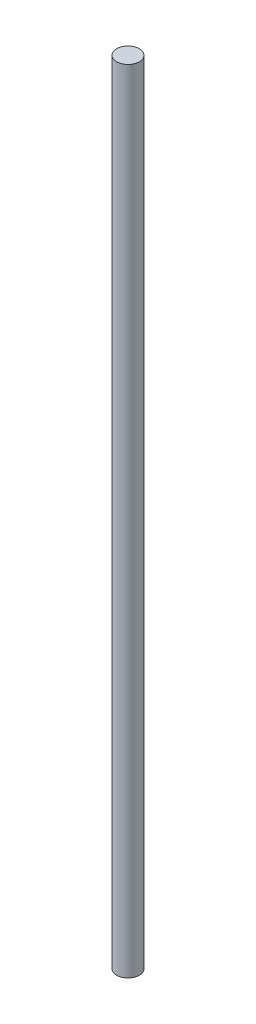
ISO-10303-21;
HEADER;
FILE_DESCRIPTION(('STEP AP214'),'2;1');
FILE_NAME('part.step','',(''),(''),'','','');
FILE_SCHEMA(('AUTOMOTIVE_DESIGN { 1 0 10303 214 1 1 1 1 }'));
ENDSEC;
DATA;
#1=APPLICATION_CONTEXT('core data for automotive mechanical design processes');
#2=APPLICATION_PROTOCOL_DEFINITION('international standard','automotive_design',2000,#1);
#3=PRODUCT_CONTEXT('',#1,'mechanical');
#4=PRODUCT('Part','Part','',(#3));
#5=PRODUCT_RELATED_PRODUCT_CATEGORY('part','',(#4));
#6=PRODUCT_DEFINITION_FORMATION('','',#4);
#7=PRODUCT_DEFINITION_CONTEXT('part definition',#1,'design');
#8=PRODUCT_DEFINITION('design','',#6,#7);
#9=PRODUCT_DEFINITION_SHAPE('','',#8);
#10=(LENGTH_UNIT() NAMED_UNIT(*) SI_UNIT(.MILLI.,.METRE.));
#11=(NAMED_UNIT(*) PLANE_ANGLE_UNIT() SI_UNIT($,.RADIAN.));
#12=(NAMED_UNIT(*) SI_UNIT($,.STERADIAN.) SOLID_ANGLE_UNIT());
#13=UNCERTAINTY_MEASURE_WITH_UNIT(LENGTH_MEASURE(1.E-05),#10,'distance_accuracy_value','');
#14=(GEOMETRIC_REPRESENTATION_CONTEXT(3) GLOBAL_UNCERTAINTY_ASSIGNED_CONTEXT((#13)) GLOBAL_UNIT_ASSIGNED_CONTEXT((#10,
#11,#12)) REPRESENTATION_CONTEXT('',''));
#15=CARTESIAN_POINT('',(0.,0.,0.));
#16=DIRECTION('',(0.,0.,1.));
#17=DIRECTION('',(1.,0.,0.));
#18=AXIS2_PLACEMENT_3D('',#15,#16,#17);
#19=CARTESIAN_POINT('',(0.,35.,0.));
#20=DIRECTION('',(0.,-1.,0.));
#21=DIRECTION('',(0.,0.,-1.));
#22=AXIS2_PLACEMENT_3D('',#19,#20,#21);
#23=CYLINDRICAL_SURFACE('',#22,0.5);
#24=CARTESIAN_POINT('',(0.,35.,0.));
#25=DIRECTION('',(0.,1.,0.));
#26=DIRECTION('',(0.,0.,1.));
#27=AXIS2_PLACEMENT_3D('',#24,#25,#26);
#28=CIRCLE('',#27,0.5);
#29=CARTESIAN_POINT('',(0.,35.,0.5));
#30=VERTEX_POINT('',#29);
#31=EDGE_CURVE('E10',#30,#30,#28,.T.);
#32=ORIENTED_EDGE('',*,*,#31,.F.);
#33=EDGE_LOOP('',(#32));
#34=FACE_BOUND('',#33,.T.);
#35=CARTESIAN_POINT('',(0.,0.,0.));
#36=DIRECTION('',(0.,1.,0.));
#37=DIRECTION('',(0.,0.,1.));
#38=AXIS2_PLACEMENT_3D('',#35,#36,#37);
#39=CIRCLE('',#38,0.5);
#40=CARTESIAN_POINT('',(0.,0.,0.5));
#41=VERTEX_POINT('',#40);
#42=EDGE_CURVE('E38',#41,#41,#39,.T.);
#43=ORIENTED_EDGE('',*,*,#42,.T.);
#44=EDGE_LOOP('',(#43));
#45=FACE_BOUND('',#44,.T.);
#46=ADVANCED_FACE('F35',(#34,#45),#23,.T.);
#47=CARTESIAN_POINT('',(0.,35.,0.));
#48=DIRECTION('',(0.,1.,0.));
#49=DIRECTION('',(0.,0.,1.));
#50=AXIS2_PLACEMENT_3D('',#47,#48,#49);
#51=PLANE('',#50);
#52=ORIENTED_EDGE('',*,*,#31,.T.);
#53=EDGE_LOOP('',(#52));
#54=FACE_BOUND('',#53,.T.);
#55=ADVANCED_FACE('F50',(#54),#51,.T.);
#56=CARTESIAN_POINT('',(0.,0.,0.));
#57=DIRECTION('',(0.,1.,0.));
#58=DIRECTION('',(0.,0.,1.));
#59=AXIS2_PLACEMENT_3D('',#56,#57,#58);
#60=PLANE('',#59);
#61=ORIENTED_EDGE('',*,*,#42,.F.);
#62=EDGE_LOOP('',(#61));
#63=FACE_BOUND('',#62,.T.);
#64=ADVANCED_FACE('F48',(#63),#60,.F.);
#65=CLOSED_SHELL('',(#46,#55,#64));
#66=MANIFOLD_SOLID_BREP('B2',#65);
#67=ADVANCED_BREP_SHAPE_REPRESENTATION('',(#18,#66),#14);
#68=SHAPE_DEFINITION_REPRESENTATION(#9,#67);
ENDSEC;
END-ISO-10303-21;
